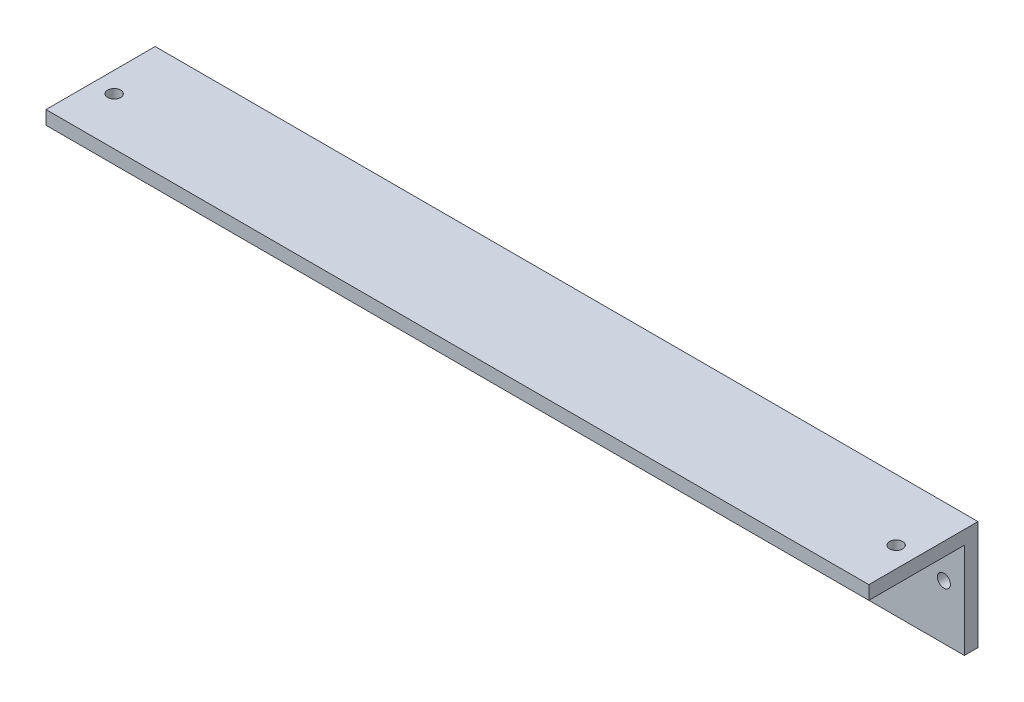
ISO-10303-21;
HEADER;
FILE_DESCRIPTION(('STEP AP214'),'2;1');
FILE_NAME('part.step','',(''),(''),'','','');
FILE_SCHEMA(('AUTOMOTIVE_DESIGN { 1 0 10303 214 1 1 1 1 }'));
ENDSEC;
DATA;
#1=APPLICATION_CONTEXT('core data for automotive mechanical design processes');
#2=APPLICATION_PROTOCOL_DEFINITION('international standard','automotive_design',2000,#1);
#3=PRODUCT_CONTEXT('',#1,'mechanical');
#4=PRODUCT('Part','Part','',(#3));
#5=PRODUCT_RELATED_PRODUCT_CATEGORY('part','',(#4));
#6=PRODUCT_DEFINITION_FORMATION('','',#4);
#7=PRODUCT_DEFINITION_CONTEXT('part definition',#1,'design');
#8=PRODUCT_DEFINITION('design','',#6,#7);
#9=PRODUCT_DEFINITION_SHAPE('','',#8);
#10=(LENGTH_UNIT() NAMED_UNIT(*) SI_UNIT(.MILLI.,.METRE.));
#11=(NAMED_UNIT(*) PLANE_ANGLE_UNIT() SI_UNIT($,.RADIAN.));
#12=(NAMED_UNIT(*) SI_UNIT($,.STERADIAN.) SOLID_ANGLE_UNIT());
#13=UNCERTAINTY_MEASURE_WITH_UNIT(LENGTH_MEASURE(1.E-05),#10,'distance_accuracy_value','');
#14=(GEOMETRIC_REPRESENTATION_CONTEXT(3) GLOBAL_UNCERTAINTY_ASSIGNED_CONTEXT((#13)) GLOBAL_UNIT_ASSIGNED_CONTEXT((#10,
#11,#12)) REPRESENTATION_CONTEXT('',''));
#15=CARTESIAN_POINT('',(0.,0.,0.));
#16=DIRECTION('',(0.,0.,1.));
#17=DIRECTION('',(1.,0.,0.));
#18=AXIS2_PLACEMENT_3D('',#15,#16,#17);
#19=CARTESIAN_POINT('',(0.,0.,10.));
#20=DIRECTION('',(0.,0.,1.));
#21=DIRECTION('',(1.,0.,0.));
#22=AXIS2_PLACEMENT_3D('',#19,#20,#21);
#23=PLANE('',#22);
#24=CARTESIAN_POINT('',(603.04,40.,10.));
#25=DIRECTION('',(0.,0.,1.));
#26=DIRECTION('',(1.,0.,0.));
#27=AXIS2_PLACEMENT_3D('',#24,#25,#26);
#28=CIRCLE('',#27,4.76250000000001);
#29=CARTESIAN_POINT('',(607.8025,40.,10.));
#30=VERTEX_POINT('',#29);
#31=EDGE_CURVE('E131',#30,#30,#28,.T.);
#32=ORIENTED_EDGE('',*,*,#31,.F.);
#33=EDGE_LOOP('',(#32));
#34=FACE_BOUND('',#33,.T.);
#35=CARTESIAN_POINT('',(30.,39.9999999999999,10.));
#36=DIRECTION('',(0.,0.,1.));
#37=DIRECTION('',(1.,0.,0.));
#38=AXIS2_PLACEMENT_3D('',#35,#36,#37);
#39=CIRCLE('',#38,4.7625);
#40=CARTESIAN_POINT('',(34.7625,39.9999999999999,10.));
#41=VERTEX_POINT('',#40);
#42=EDGE_CURVE('E118',#41,#41,#39,.T.);
#43=ORIENTED_EDGE('',*,*,#42,.F.);
#44=EDGE_LOOP('',(#43));
#45=FACE_BOUND('',#44,.T.);
#46=DIRECTION('',(1.,0.,0.));
#47=VECTOR('',#46,1.);
#48=CARTESIAN_POINT('',(633.04,70.,10.));
#49=LINE('',#48,#47);
#50=CARTESIAN_POINT('',(15.,70.,10.));
#51=VERTEX_POINT('',#50);
#52=CARTESIAN_POINT('',(618.04,70.,10.));
#53=VERTEX_POINT('',#52);
#54=EDGE_CURVE('E120',#51,#53,#49,.T.);
#55=ORIENTED_EDGE('',*,*,#54,.F.);
#56=DIRECTION('',(0.,1.,0.));
#57=VECTOR('',#56,1.);
#58=CARTESIAN_POINT('',(15.,0.,10.));
#59=LINE('',#58,#57);
#60=CARTESIAN_POINT('',(15.,0.,10.));
#61=VERTEX_POINT('',#60);
#62=EDGE_CURVE('E196',#61,#51,#59,.T.);
#63=ORIENTED_EDGE('',*,*,#62,.F.);
#64=DIRECTION('',(1.,0.,0.));
#65=VECTOR('',#64,1.);
#66=CARTESIAN_POINT('',(0.,0.,10.));
#67=LINE('',#66,#65);
#68=CARTESIAN_POINT('',(618.04,0.,10.));
#69=VERTEX_POINT('',#68);
#70=EDGE_CURVE('E11',#61,#69,#67,.T.);
#71=ORIENTED_EDGE('',*,*,#70,.T.);
#72=DIRECTION('',(0.,-1.,0.));
#73=VECTOR('',#72,1.);
#74=CARTESIAN_POINT('',(618.04,0.,10.));
#75=LINE('',#74,#73);
#76=EDGE_CURVE('E155',#53,#69,#75,.T.);
#77=ORIENTED_EDGE('',*,*,#76,.F.);
#78=EDGE_LOOP('',(#55,#63,#71,#77));
#79=FACE_BOUND('',#78,.T.);
#80=ADVANCED_FACE('F38',(#34,#45,#79),#23,.T.);
#81=CARTESIAN_POINT('',(0.,0.,0.));
#82=DIRECTION('',(0.,0.,1.));
#83=DIRECTION('',(1.,0.,0.));
#84=AXIS2_PLACEMENT_3D('',#81,#82,#83);
#85=PLANE('',#84);
#86=CARTESIAN_POINT('',(30.,39.9999999999999,0.));
#87=DIRECTION('',(0.,0.,1.));
#88=DIRECTION('',(1.,0.,0.));
#89=AXIS2_PLACEMENT_3D('',#86,#87,#88);
#90=CIRCLE('',#89,4.7625);
#91=CARTESIAN_POINT('',(34.7625,39.9999999999999,0.));
#92=VERTEX_POINT('',#91);
#93=EDGE_CURVE('E112',#92,#92,#90,.T.);
#94=ORIENTED_EDGE('',*,*,#93,.T.);
#95=EDGE_LOOP('',(#94));
#96=FACE_BOUND('',#95,.T.);
#97=CARTESIAN_POINT('',(603.04,40.,0.));
#98=DIRECTION('',(0.,0.,1.));
#99=DIRECTION('',(1.,0.,0.));
#100=AXIS2_PLACEMENT_3D('',#97,#98,#99);
#101=CIRCLE('',#100,4.76250000000001);
#102=CARTESIAN_POINT('',(607.8025,40.,0.));
#103=VERTEX_POINT('',#102);
#104=EDGE_CURVE('E129',#103,#103,#101,.T.);
#105=ORIENTED_EDGE('',*,*,#104,.T.);
#106=EDGE_LOOP('',(#105));
#107=FACE_BOUND('',#106,.T.);
#108=DIRECTION('',(0.,-1.,0.));
#109=VECTOR('',#108,1.);
#110=CARTESIAN_POINT('',(15.,79.9999999999999,0.));
#111=LINE('',#110,#109);
#112=CARTESIAN_POINT('',(15.,79.9999999999999,0.));
#113=VERTEX_POINT('',#112);
#114=CARTESIAN_POINT('',(15.,0.,0.));
#115=VERTEX_POINT('',#114);
#116=EDGE_CURVE('E107',#113,#115,#111,.T.);
#117=ORIENTED_EDGE('',*,*,#116,.F.);
#118=DIRECTION('',(-1.,0.,0.));
#119=VECTOR('',#118,1.);
#120=CARTESIAN_POINT('',(633.04,80.,0.));
#121=LINE('',#120,#119);
#122=CARTESIAN_POINT('',(618.04,80.,0.));
#123=VERTEX_POINT('',#122);
#124=EDGE_CURVE('E42',#123,#113,#121,.T.);
#125=ORIENTED_EDGE('',*,*,#124,.F.);
#126=DIRECTION('',(0.,1.,0.));
#127=VECTOR('',#126,1.);
#128=CARTESIAN_POINT('',(618.04,80.,0.));
#129=LINE('',#128,#127);
#130=CARTESIAN_POINT('',(618.04,-8.57702797674165E-13,0.));
#131=VERTEX_POINT('',#130);
#132=EDGE_CURVE('E153',#131,#123,#129,.T.);
#133=ORIENTED_EDGE('',*,*,#132,.F.);
#134=DIRECTION('',(1.,0.,0.));
#135=VECTOR('',#134,1.);
#136=CARTESIAN_POINT('',(0.,0.,0.));
#137=LINE('',#136,#135);
#138=EDGE_CURVE('E135',#115,#131,#137,.T.);
#139=ORIENTED_EDGE('',*,*,#138,.F.);
#140=EDGE_LOOP('',(#117,#125,#133,#139));
#141=FACE_BOUND('',#140,.T.);
#142=ADVANCED_FACE('F158',(#96,#107,#141),#85,.F.);
#143=CARTESIAN_POINT('',(0.,0.,10.));
#144=DIRECTION('',(0.,1.,0.));
#145=DIRECTION('',(0.,0.,1.));
#146=AXIS2_PLACEMENT_3D('',#143,#144,#145);
#147=PLANE('',#146);
#148=DIRECTION('',(0.,0.,1.));
#149=VECTOR('',#148,1.);
#150=CARTESIAN_POINT('',(15.,0.,0.));
#151=LINE('',#150,#149);
#152=EDGE_CURVE('E147',#115,#61,#151,.T.);
#153=ORIENTED_EDGE('',*,*,#152,.F.);
#154=ORIENTED_EDGE('',*,*,#138,.T.);
#155=DIRECTION('',(0.,0.,-1.));
#156=VECTOR('',#155,1.);
#157=CARTESIAN_POINT('',(618.04,-8.57702797674165E-13,0.));
#158=LINE('',#157,#156);
#159=EDGE_CURVE('E146',#69,#131,#158,.T.);
#160=ORIENTED_EDGE('',*,*,#159,.F.);
#161=ORIENTED_EDGE('',*,*,#70,.F.);
#162=EDGE_LOOP('',(#153,#154,#160,#161));
#163=FACE_BOUND('',#162,.T.);
#164=ADVANCED_FACE('F40',(#163),#147,.F.);
#165=CARTESIAN_POINT('',(633.04,80.,10.));
#166=DIRECTION('',(0.,-1.,0.));
#167=DIRECTION('',(1.,0.,0.));
#168=AXIS2_PLACEMENT_3D('',#165,#166,#167);
#169=PLANE('',#168);
#170=CARTESIAN_POINT('',(603.04,80.0000000000001,45.));
#171=DIRECTION('',(0.,-1.,0.));
#172=DIRECTION('',(1.,0.,0.));
#173=AXIS2_PLACEMENT_3D('',#170,#171,#172);
#174=CIRCLE('',#173,4.76500000000001);
#175=CARTESIAN_POINT('',(607.805,80.0000000000001,45.));
#176=VERTEX_POINT('',#175);
#177=EDGE_CURVE('E175',#176,#176,#174,.T.);
#178=ORIENTED_EDGE('',*,*,#177,.T.);
#179=EDGE_LOOP('',(#178));
#180=FACE_BOUND('',#179,.T.);
#181=CARTESIAN_POINT('',(30.,80.,45.));
#182=DIRECTION('',(0.,-1.,0.));
#183=DIRECTION('',(1.,0.,0.));
#184=AXIS2_PLACEMENT_3D('',#181,#182,#183);
#185=CIRCLE('',#184,4.7625);
#186=CARTESIAN_POINT('',(34.7625,80.,45.));
#187=VERTEX_POINT('',#186);
#188=EDGE_CURVE('E126',#187,#187,#185,.T.);
#189=ORIENTED_EDGE('',*,*,#188,.T.);
#190=EDGE_LOOP('',(#189));
#191=FACE_BOUND('',#190,.T.);
#192=DIRECTION('',(0.,0.,-1.));
#193=VECTOR('',#192,1.);
#194=CARTESIAN_POINT('',(15.,79.9999999999999,80.));
#195=LINE('',#194,#193);
#196=CARTESIAN_POINT('',(15.,79.9999999999999,80.));
#197=VERTEX_POINT('',#196);
#198=EDGE_CURVE('E93',#197,#113,#195,.T.);
#199=ORIENTED_EDGE('',*,*,#198,.F.);
#200=DIRECTION('',(-1.,0.,0.));
#201=VECTOR('',#200,1.);
#202=CARTESIAN_POINT('',(0.,79.9999999999999,80.));
#203=LINE('',#202,#201);
#204=CARTESIAN_POINT('',(618.04,80.,80.));
#205=VERTEX_POINT('',#204);
#206=EDGE_CURVE('E104',#205,#197,#203,.T.);
#207=ORIENTED_EDGE('',*,*,#206,.F.);
#208=DIRECTION('',(0.,0.,1.));
#209=VECTOR('',#208,1.);
#210=CARTESIAN_POINT('',(618.04,80.,80.));
#211=LINE('',#210,#209);
#212=EDGE_CURVE('E63',#123,#205,#211,.T.);
#213=ORIENTED_EDGE('',*,*,#212,.F.);
#214=ORIENTED_EDGE('',*,*,#124,.T.);
#215=EDGE_LOOP('',(#199,#207,#213,#214));
#216=FACE_BOUND('',#215,.T.);
#217=ADVANCED_FACE('F103',(#180,#191,#216),#169,.F.);
#218=CARTESIAN_POINT('',(633.04,70.,80.));
#219=DIRECTION('',(0.,1.,0.));
#220=DIRECTION('',(-1.,0.,0.));
#221=AXIS2_PLACEMENT_3D('',#218,#219,#220);
#222=PLANE('',#221);
#223=CARTESIAN_POINT('',(603.04,70.,45.));
#224=DIRECTION('',(0.,-1.,0.));
#225=DIRECTION('',(1.,0.,0.));
#226=AXIS2_PLACEMENT_3D('',#223,#224,#225);
#227=CIRCLE('',#226,4.76500000000001);
#228=CARTESIAN_POINT('',(607.805,70.,45.));
#229=VERTEX_POINT('',#228);
#230=EDGE_CURVE('E167',#229,#229,#227,.T.);
#231=ORIENTED_EDGE('',*,*,#230,.F.);
#232=EDGE_LOOP('',(#231));
#233=FACE_BOUND('',#232,.T.);
#234=CARTESIAN_POINT('',(30.,69.9999999999999,45.));
#235=DIRECTION('',(0.,-1.,0.));
#236=DIRECTION('',(1.,0.,0.));
#237=AXIS2_PLACEMENT_3D('',#234,#235,#236);
#238=CIRCLE('',#237,4.7625);
#239=CARTESIAN_POINT('',(34.7625,69.9999999999999,45.));
#240=VERTEX_POINT('',#239);
#241=EDGE_CURVE('E171',#240,#240,#238,.T.);
#242=ORIENTED_EDGE('',*,*,#241,.F.);
#243=EDGE_LOOP('',(#242));
#244=FACE_BOUND('',#243,.T.);
#245=DIRECTION('',(0.,0.,1.));
#246=VECTOR('',#245,1.);
#247=CARTESIAN_POINT('',(15.,70.,10.));
#248=LINE('',#247,#246);
#249=CARTESIAN_POINT('',(15.,69.9999999999999,80.));
#250=VERTEX_POINT('',#249);
#251=EDGE_CURVE('E55',#51,#250,#248,.T.);
#252=ORIENTED_EDGE('',*,*,#251,.F.);
#253=ORIENTED_EDGE('',*,*,#54,.T.);
#254=DIRECTION('',(0.,0.,-1.));
#255=VECTOR('',#254,1.);
#256=CARTESIAN_POINT('',(618.04,70.,10.));
#257=LINE('',#256,#255);
#258=CARTESIAN_POINT('',(618.04,70.,80.));
#259=VERTEX_POINT('',#258);
#260=EDGE_CURVE('E198',#259,#53,#257,.T.);
#261=ORIENTED_EDGE('',*,*,#260,.F.);
#262=DIRECTION('',(1.,0.,0.));
#263=VECTOR('',#262,1.);
#264=CARTESIAN_POINT('',(633.04,70.,80.));
#265=LINE('',#264,#263);
#266=EDGE_CURVE('E113',#250,#259,#265,.T.);
#267=ORIENTED_EDGE('',*,*,#266,.F.);
#268=EDGE_LOOP('',(#252,#253,#261,#267));
#269=FACE_BOUND('',#268,.T.);
#270=ADVANCED_FACE('F184',(#233,#244,#269),#222,.F.);
#271=CARTESIAN_POINT('',(0.,0.,80.));
#272=DIRECTION('',(0.,0.,-1.));
#273=DIRECTION('',(-1.,0.,0.));
#274=AXIS2_PLACEMENT_3D('',#271,#272,#273);
#275=PLANE('',#274);
#276=DIRECTION('',(0.,1.,0.));
#277=VECTOR('',#276,1.);
#278=CARTESIAN_POINT('',(15.,69.9999999999999,80.));
#279=LINE('',#278,#277);
#280=EDGE_CURVE('E90',#250,#197,#279,.T.);
#281=ORIENTED_EDGE('',*,*,#280,.F.);
#282=ORIENTED_EDGE('',*,*,#266,.T.);
#283=DIRECTION('',(0.,-1.,0.));
#284=VECTOR('',#283,1.);
#285=CARTESIAN_POINT('',(618.04,70.,80.));
#286=LINE('',#285,#284);
#287=EDGE_CURVE('E110',#205,#259,#286,.T.);
#288=ORIENTED_EDGE('',*,*,#287,.F.);
#289=ORIENTED_EDGE('',*,*,#206,.T.);
#290=EDGE_LOOP('',(#281,#282,#288,#289));
#291=FACE_BOUND('',#290,.T.);
#292=ADVANCED_FACE('F109',(#291),#275,.F.);
#293=CARTESIAN_POINT('',(603.04,40.,10.));
#294=DIRECTION('',(0.,0.,-1.));
#295=DIRECTION('',(-1.,0.,0.));
#296=AXIS2_PLACEMENT_3D('',#293,#294,#295);
#297=CYLINDRICAL_SURFACE('',#296,4.76250000000001);
#298=ORIENTED_EDGE('',*,*,#31,.T.);
#299=EDGE_LOOP('',(#298));
#300=FACE_BOUND('',#299,.T.);
#301=ORIENTED_EDGE('',*,*,#104,.F.);
#302=EDGE_LOOP('',(#301));
#303=FACE_BOUND('',#302,.T.);
#304=ADVANCED_FACE('F219',(#300,#303),#297,.F.);
#305=CARTESIAN_POINT('',(30.,39.9999999999999,10.));
#306=DIRECTION('',(0.,0.,-1.));
#307=DIRECTION('',(-1.,0.,0.));
#308=AXIS2_PLACEMENT_3D('',#305,#306,#307);
#309=CYLINDRICAL_SURFACE('',#308,4.7625);
#310=ORIENTED_EDGE('',*,*,#42,.T.);
#311=EDGE_LOOP('',(#310));
#312=FACE_BOUND('',#311,.T.);
#313=ORIENTED_EDGE('',*,*,#93,.F.);
#314=EDGE_LOOP('',(#313));
#315=FACE_BOUND('',#314,.T.);
#316=ADVANCED_FACE('F240',(#312,#315),#309,.F.);
#317=CARTESIAN_POINT('',(603.04,80.0000000000001,45.));
#318=DIRECTION('',(0.,-1.,0.));
#319=DIRECTION('',(1.,0.,0.));
#320=AXIS2_PLACEMENT_3D('',#317,#318,#319);
#321=CYLINDRICAL_SURFACE('',#320,4.76500000000001);
#322=ORIENTED_EDGE('',*,*,#177,.F.);
#323=EDGE_LOOP('',(#322));
#324=FACE_BOUND('',#323,.T.);
#325=ORIENTED_EDGE('',*,*,#230,.T.);
#326=EDGE_LOOP('',(#325));
#327=FACE_BOUND('',#326,.T.);
#328=ADVANCED_FACE('F182',(#324,#327),#321,.F.);
#329=CARTESIAN_POINT('',(30.,80.,45.));
#330=DIRECTION('',(0.,-1.,0.));
#331=DIRECTION('',(1.,0.,0.));
#332=AXIS2_PLACEMENT_3D('',#329,#330,#331);
#333=CYLINDRICAL_SURFACE('',#332,4.7625);
#334=ORIENTED_EDGE('',*,*,#188,.F.);
#335=EDGE_LOOP('',(#334));
#336=FACE_BOUND('',#335,.T.);
#337=ORIENTED_EDGE('',*,*,#241,.T.);
#338=EDGE_LOOP('',(#337));
#339=FACE_BOUND('',#338,.T.);
#340=ADVANCED_FACE('F230',(#336,#339),#333,.F.);
#341=CARTESIAN_POINT('',(618.04,0.,0.));
#342=DIRECTION('',(-1.,0.,0.));
#343=DIRECTION('',(0.,0.,1.));
#344=AXIS2_PLACEMENT_3D('',#341,#342,#343);
#345=PLANE('',#344);
#346=ORIENTED_EDGE('',*,*,#260,.T.);
#347=ORIENTED_EDGE('',*,*,#76,.T.);
#348=ORIENTED_EDGE('',*,*,#159,.T.);
#349=ORIENTED_EDGE('',*,*,#132,.T.);
#350=ORIENTED_EDGE('',*,*,#212,.T.);
#351=ORIENTED_EDGE('',*,*,#287,.T.);
#352=EDGE_LOOP('',(#346,#347,#348,#349,#350,#351));
#353=FACE_BOUND('',#352,.T.);
#354=ADVANCED_FACE('F152',(#353),#345,.F.);
#355=CARTESIAN_POINT('',(15.,0.,0.));
#356=DIRECTION('',(-1.,0.,0.));
#357=DIRECTION('',(0.,0.,1.));
#358=AXIS2_PLACEMENT_3D('',#355,#356,#357);
#359=PLANE('',#358);
#360=ORIENTED_EDGE('',*,*,#251,.T.);
#361=ORIENTED_EDGE('',*,*,#280,.T.);
#362=ORIENTED_EDGE('',*,*,#198,.T.);
#363=ORIENTED_EDGE('',*,*,#116,.T.);
#364=ORIENTED_EDGE('',*,*,#152,.T.);
#365=ORIENTED_EDGE('',*,*,#62,.T.);
#366=EDGE_LOOP('',(#360,#361,#362,#363,#364,#365));
#367=FACE_BOUND('',#366,.T.);
#368=ADVANCED_FACE('F92',(#367),#359,.T.);
#369=CLOSED_SHELL('',(#80,#142,#164,#217,#270,#292,#304,#316,#328,#340,#354,#368));
#370=MANIFOLD_SOLID_BREP('B2',#369);
#371=ADVANCED_BREP_SHAPE_REPRESENTATION('',(#18,#370),#14);
#372=SHAPE_DEFINITION_REPRESENTATION(#9,#371);
ENDSEC;
END-ISO-10303-21;
